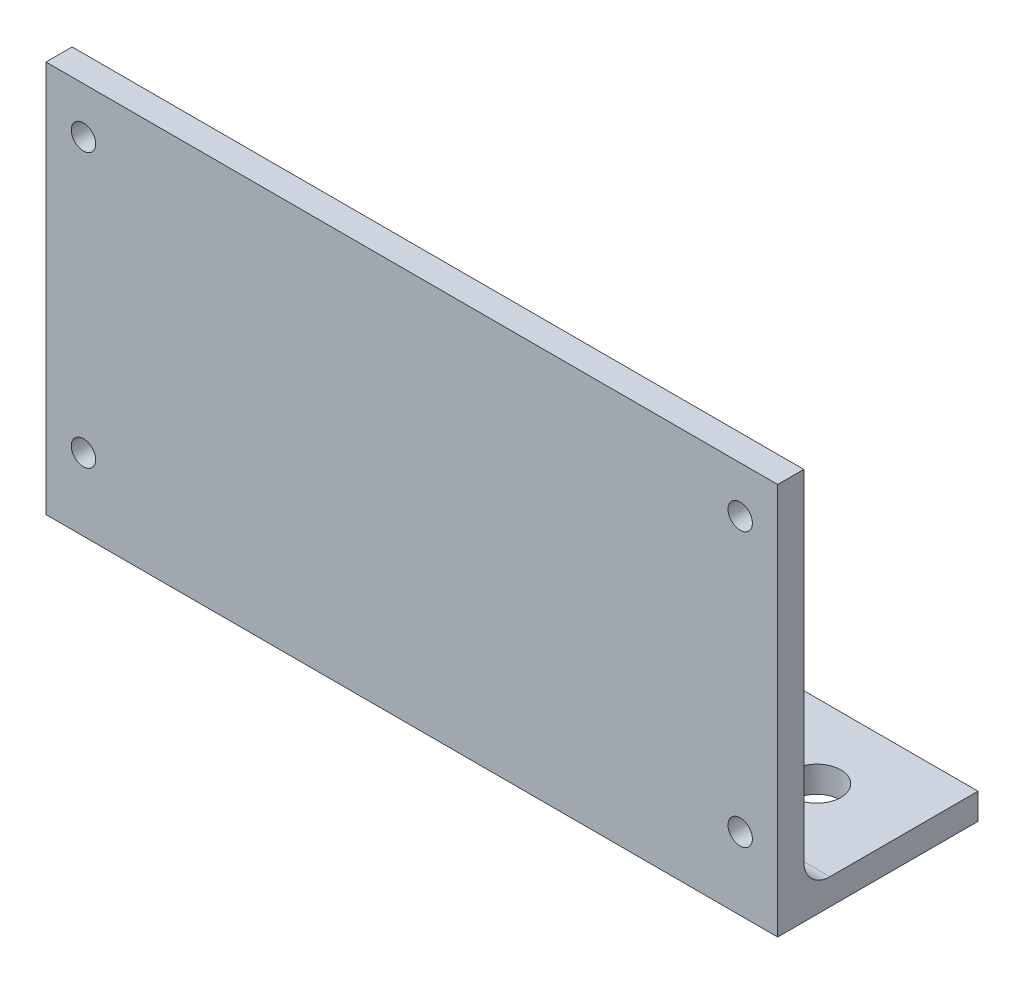
ISO-10303-21;
HEADER;
FILE_DESCRIPTION(('STEP AP214'),'2;1');
FILE_NAME('part.step','',(''),(''),'','','');
FILE_SCHEMA(('AUTOMOTIVE_DESIGN { 1 0 10303 214 1 1 1 1 }'));
ENDSEC;
DATA;
#1=APPLICATION_CONTEXT('core data for automotive mechanical design processes');
#2=APPLICATION_PROTOCOL_DEFINITION('international standard','automotive_design',2000,#1);
#3=PRODUCT_CONTEXT('',#1,'mechanical');
#4=PRODUCT('Part','Part','',(#3));
#5=PRODUCT_RELATED_PRODUCT_CATEGORY('part','',(#4));
#6=PRODUCT_DEFINITION_FORMATION('','',#4);
#7=PRODUCT_DEFINITION_CONTEXT('part definition',#1,'design');
#8=PRODUCT_DEFINITION('design','',#6,#7);
#9=PRODUCT_DEFINITION_SHAPE('','',#8);
#10=(LENGTH_UNIT() NAMED_UNIT(*) SI_UNIT(.MILLI.,.METRE.));
#11=(NAMED_UNIT(*) PLANE_ANGLE_UNIT() SI_UNIT($,.RADIAN.));
#12=(NAMED_UNIT(*) SI_UNIT($,.STERADIAN.) SOLID_ANGLE_UNIT());
#13=UNCERTAINTY_MEASURE_WITH_UNIT(LENGTH_MEASURE(1.E-05),#10,'distance_accuracy_value','');
#14=(GEOMETRIC_REPRESENTATION_CONTEXT(3) GLOBAL_UNCERTAINTY_ASSIGNED_CONTEXT((#13)) GLOBAL_UNIT_ASSIGNED_CONTEXT((#10,
#11,#12)) REPRESENTATION_CONTEXT('',''));
#15=CARTESIAN_POINT('',(0.,0.,0.));
#16=DIRECTION('',(0.,0.,1.));
#17=DIRECTION('',(1.,0.,0.));
#18=AXIS2_PLACEMENT_3D('',#15,#16,#17);
#19=CARTESIAN_POINT('',(0.,0.,3.));
#20=DIRECTION('',(0.,0.,-1.));
#21=DIRECTION('',(-1.,0.,0.));
#22=AXIS2_PLACEMENT_3D('',#19,#20,#21);
#23=PLANE('',#22);
#24=DIRECTION('',(0.,1.,0.));
#25=VECTOR('',#24,1.);
#26=CARTESIAN_POINT('',(42.,-21.,3.));
#27=LINE('',#26,#25);
#28=CARTESIAN_POINT('',(42.,-24.,3.));
#29=VERTEX_POINT('',#28);
#30=CARTESIAN_POINT('',(42.,21.,3.));
#31=VERTEX_POINT('',#30);
#32=EDGE_CURVE('E103',#29,#31,#27,.T.);
#33=ORIENTED_EDGE('',*,*,#32,.T.);
#34=DIRECTION('',(-1.,0.,0.));
#35=VECTOR('',#34,1.);
#36=CARTESIAN_POINT('',(-42.,21.,3.));
#37=LINE('',#36,#35);
#38=CARTESIAN_POINT('',(-42.,21.,3.));
#39=VERTEX_POINT('',#38);
#40=EDGE_CURVE('E166',#31,#39,#37,.T.);
#41=ORIENTED_EDGE('',*,*,#40,.T.);
#42=DIRECTION('',(0.,-1.,0.));
#43=VECTOR('',#42,1.);
#44=CARTESIAN_POINT('',(-42.,-21.,3.));
#45=LINE('',#44,#43);
#46=CARTESIAN_POINT('',(-42.,-24.,3.));
#47=VERTEX_POINT('',#46);
#48=EDGE_CURVE('E169',#39,#47,#45,.T.);
#49=ORIENTED_EDGE('',*,*,#48,.T.);
#50=DIRECTION('',(1.,0.,0.));
#51=VECTOR('',#50,1.);
#52=CARTESIAN_POINT('',(42.,-24.,3.));
#53=LINE('',#52,#51);
#54=EDGE_CURVE('E135',#47,#29,#53,.T.);
#55=ORIENTED_EDGE('',*,*,#54,.T.);
#56=EDGE_LOOP('',(#33,#41,#49,#55));
#57=FACE_BOUND('',#56,.T.);
#58=CARTESIAN_POINT('',(-37.7,15.7,3.));
#59=DIRECTION('',(0.,0.,1.));
#60=DIRECTION('',(1.,0.,0.));
#61=AXIS2_PLACEMENT_3D('',#58,#59,#60);
#62=CIRCLE('',#61,1.4);
#63=CARTESIAN_POINT('',(-36.3,15.7,3.));
#64=VERTEX_POINT('',#63);
#65=EDGE_CURVE('E159',#64,#64,#62,.T.);
#66=ORIENTED_EDGE('',*,*,#65,.F.);
#67=EDGE_LOOP('',(#66));
#68=FACE_BOUND('',#67,.T.);
#69=CARTESIAN_POINT('',(37.7,15.7,3.));
#70=DIRECTION('',(0.,0.,1.));
#71=DIRECTION('',(1.,0.,0.));
#72=AXIS2_PLACEMENT_3D('',#69,#70,#71);
#73=CIRCLE('',#72,1.4);
#74=CARTESIAN_POINT('',(39.1,15.7,3.));
#75=VERTEX_POINT('',#74);
#76=EDGE_CURVE('E153',#75,#75,#73,.T.);
#77=ORIENTED_EDGE('',*,*,#76,.F.);
#78=EDGE_LOOP('',(#77));
#79=FACE_BOUND('',#78,.T.);
#80=CARTESIAN_POINT('',(37.7,-15.7,3.));
#81=DIRECTION('',(0.,0.,1.));
#82=DIRECTION('',(1.,0.,0.));
#83=AXIS2_PLACEMENT_3D('',#80,#81,#82);
#84=CIRCLE('',#83,1.4);
#85=CARTESIAN_POINT('',(39.1,-15.7,3.));
#86=VERTEX_POINT('',#85);
#87=EDGE_CURVE('E147',#86,#86,#84,.T.);
#88=ORIENTED_EDGE('',*,*,#87,.F.);
#89=EDGE_LOOP('',(#88));
#90=FACE_BOUND('',#89,.T.);
#91=CARTESIAN_POINT('',(-37.7,-15.7,3.));
#92=DIRECTION('',(0.,0.,1.));
#93=DIRECTION('',(1.,0.,0.));
#94=AXIS2_PLACEMENT_3D('',#91,#92,#93);
#95=CIRCLE('',#94,1.4);
#96=CARTESIAN_POINT('',(-36.3,-15.7,3.));
#97=VERTEX_POINT('',#96);
#98=EDGE_CURVE('E141',#97,#97,#95,.T.);
#99=ORIENTED_EDGE('',*,*,#98,.F.);
#100=EDGE_LOOP('',(#99));
#101=FACE_BOUND('',#100,.T.);
#102=ADVANCED_FACE('F39',(#57,#68,#79,#90,#101),#23,.F.);
#103=CARTESIAN_POINT('',(0.,0.,0.));
#104=DIRECTION('',(0.,0.,-1.));
#105=DIRECTION('',(-1.,0.,0.));
#106=AXIS2_PLACEMENT_3D('',#103,#104,#105);
#107=PLANE('',#106);
#108=CARTESIAN_POINT('',(37.7,-15.7,0.));
#109=DIRECTION('',(0.,0.,1.));
#110=DIRECTION('',(1.,0.,0.));
#111=AXIS2_PLACEMENT_3D('',#108,#109,#110);
#112=CIRCLE('',#111,1.4);
#113=CARTESIAN_POINT('',(39.1,-15.7,0.));
#114=VERTEX_POINT('',#113);
#115=EDGE_CURVE('E144',#114,#114,#112,.T.);
#116=ORIENTED_EDGE('',*,*,#115,.T.);
#117=EDGE_LOOP('',(#116));
#118=FACE_BOUND('',#117,.T.);
#119=CARTESIAN_POINT('',(-37.7,15.7,0.));
#120=DIRECTION('',(0.,0.,1.));
#121=DIRECTION('',(1.,0.,0.));
#122=AXIS2_PLACEMENT_3D('',#119,#120,#121);
#123=CIRCLE('',#122,1.4);
#124=CARTESIAN_POINT('',(-36.3,15.7,0.));
#125=VERTEX_POINT('',#124);
#126=EDGE_CURVE('E156',#125,#125,#123,.T.);
#127=ORIENTED_EDGE('',*,*,#126,.T.);
#128=EDGE_LOOP('',(#127));
#129=FACE_BOUND('',#128,.T.);
#130=DIRECTION('',(0.,1.,0.));
#131=VECTOR('',#130,1.);
#132=CARTESIAN_POINT('',(42.,-21.,0.));
#133=LINE('',#132,#131);
#134=CARTESIAN_POINT('',(42.,-18.,0.));
#135=VERTEX_POINT('',#134);
#136=CARTESIAN_POINT('',(42.,21.,0.));
#137=VERTEX_POINT('',#136);
#138=EDGE_CURVE('E162',#135,#137,#133,.T.);
#139=ORIENTED_EDGE('',*,*,#138,.F.);
#140=DIRECTION('',(1.,0.,0.));
#141=VECTOR('',#140,1.);
#142=CARTESIAN_POINT('',(-42.,-18.,0.));
#143=LINE('',#142,#141);
#144=CARTESIAN_POINT('',(-42.,-18.,0.));
#145=VERTEX_POINT('',#144);
#146=EDGE_CURVE('E54',#135,#145,#143,.F.);
#147=ORIENTED_EDGE('',*,*,#146,.T.);
#148=DIRECTION('',(0.,-1.,0.));
#149=VECTOR('',#148,1.);
#150=CARTESIAN_POINT('',(-42.,-21.,0.));
#151=LINE('',#150,#149);
#152=CARTESIAN_POINT('',(-42.,21.,0.));
#153=VERTEX_POINT('',#152);
#154=EDGE_CURVE('E167',#153,#145,#151,.T.);
#155=ORIENTED_EDGE('',*,*,#154,.F.);
#156=DIRECTION('',(-1.,0.,0.));
#157=VECTOR('',#156,1.);
#158=CARTESIAN_POINT('',(-42.,21.,0.));
#159=LINE('',#158,#157);
#160=EDGE_CURVE('E173',#137,#153,#159,.T.);
#161=ORIENTED_EDGE('',*,*,#160,.F.);
#162=EDGE_LOOP('',(#139,#147,#155,#161));
#163=FACE_BOUND('',#162,.T.);
#164=CARTESIAN_POINT('',(37.7,15.7,0.));
#165=DIRECTION('',(0.,0.,1.));
#166=DIRECTION('',(1.,0.,0.));
#167=AXIS2_PLACEMENT_3D('',#164,#165,#166);
#168=CIRCLE('',#167,1.4);
#169=CARTESIAN_POINT('',(39.1,15.7,0.));
#170=VERTEX_POINT('',#169);
#171=EDGE_CURVE('E150',#170,#170,#168,.T.);
#172=ORIENTED_EDGE('',*,*,#171,.T.);
#173=EDGE_LOOP('',(#172));
#174=FACE_BOUND('',#173,.T.);
#175=CARTESIAN_POINT('',(-37.7,-15.7,0.));
#176=DIRECTION('',(0.,0.,1.));
#177=DIRECTION('',(1.,0.,0.));
#178=AXIS2_PLACEMENT_3D('',#175,#176,#177);
#179=CIRCLE('',#178,1.4);
#180=CARTESIAN_POINT('',(-36.3,-15.7,0.));
#181=VERTEX_POINT('',#180);
#182=EDGE_CURVE('E140',#181,#181,#179,.T.);
#183=ORIENTED_EDGE('',*,*,#182,.T.);
#184=EDGE_LOOP('',(#183));
#185=FACE_BOUND('',#184,.T.);
#186=ADVANCED_FACE('F195',(#118,#129,#163,#174,#185),#107,.T.);
#187=CARTESIAN_POINT('',(42.,-21.,3.));
#188=DIRECTION('',(-1.,0.,0.));
#189=DIRECTION('',(0.,0.,1.));
#190=AXIS2_PLACEMENT_3D('',#187,#188,#189);
#191=PLANE('',#190);
#192=DIRECTION('',(0.,0.,-1.));
#193=VECTOR('',#192,1.);
#194=CARTESIAN_POINT('',(42.,-21.,87.0535543567314));
#195=LINE('',#194,#193);
#196=CARTESIAN_POINT('',(42.,-21.,-3.));
#197=VERTEX_POINT('',#196);
#198=CARTESIAN_POINT('',(42.,-21.,-20.));
#199=VERTEX_POINT('',#198);
#200=EDGE_CURVE('E133',#197,#199,#195,.T.);
#201=ORIENTED_EDGE('',*,*,#200,.F.);
#202=CARTESIAN_POINT('',(42.,-18.,-3.));
#203=DIRECTION('',(-1.,0.,0.));
#204=DIRECTION('',(0.,0.,1.));
#205=AXIS2_PLACEMENT_3D('',#202,#203,#204);
#206=CIRCLE('',#205,3.);
#207=EDGE_CURVE('E47',#197,#135,#206,.T.);
#208=ORIENTED_EDGE('',*,*,#207,.T.);
#209=ORIENTED_EDGE('',*,*,#138,.T.);
#210=DIRECTION('',(0.,0.,-1.));
#211=VECTOR('',#210,1.);
#212=CARTESIAN_POINT('',(42.,21.,3.));
#213=LINE('',#212,#211);
#214=EDGE_CURVE('E178',#31,#137,#213,.T.);
#215=ORIENTED_EDGE('',*,*,#214,.F.);
#216=ORIENTED_EDGE('',*,*,#32,.F.);
#217=DIRECTION('',(0.,0.,-1.));
#218=VECTOR('',#217,1.);
#219=CARTESIAN_POINT('',(42.,-24.,87.0535543567314));
#220=LINE('',#219,#218);
#221=CARTESIAN_POINT('',(42.,-24.,-20.));
#222=VERTEX_POINT('',#221);
#223=EDGE_CURVE('E96',#29,#222,#220,.T.);
#224=ORIENTED_EDGE('',*,*,#223,.T.);
#225=DIRECTION('',(0.,-1.,0.));
#226=VECTOR('',#225,1.);
#227=CARTESIAN_POINT('',(42.,-21.,-20.));
#228=LINE('',#227,#226);
#229=EDGE_CURVE('E100',#199,#222,#228,.T.);
#230=ORIENTED_EDGE('',*,*,#229,.F.);
#231=EDGE_LOOP('',(#201,#208,#209,#215,#216,#224,#230));
#232=FACE_BOUND('',#231,.T.);
#233=ADVANCED_FACE('F98',(#232),#191,.F.);
#234=CARTESIAN_POINT('',(-42.,21.,3.));
#235=DIRECTION('',(0.,-1.,0.));
#236=DIRECTION('',(0.,0.,-1.));
#237=AXIS2_PLACEMENT_3D('',#234,#235,#236);
#238=PLANE('',#237);
#239=ORIENTED_EDGE('',*,*,#160,.T.);
#240=DIRECTION('',(0.,0.,-1.));
#241=VECTOR('',#240,1.);
#242=CARTESIAN_POINT('',(-42.,21.,3.));
#243=LINE('',#242,#241);
#244=EDGE_CURVE('E171',#39,#153,#243,.T.);
#245=ORIENTED_EDGE('',*,*,#244,.F.);
#246=ORIENTED_EDGE('',*,*,#40,.F.);
#247=ORIENTED_EDGE('',*,*,#214,.T.);
#248=EDGE_LOOP('',(#239,#245,#246,#247));
#249=FACE_BOUND('',#248,.T.);
#250=ADVANCED_FACE('F198',(#249),#238,.F.);
#251=CARTESIAN_POINT('',(-42.,-21.,3.));
#252=DIRECTION('',(1.,0.,0.));
#253=DIRECTION('',(0.,0.,-1.));
#254=AXIS2_PLACEMENT_3D('',#251,#252,#253);
#255=PLANE('',#254);
#256=ORIENTED_EDGE('',*,*,#154,.T.);
#257=CARTESIAN_POINT('',(-42.,-18.,-3.));
#258=DIRECTION('',(1.,0.,0.));
#259=DIRECTION('',(0.,0.,-1.));
#260=AXIS2_PLACEMENT_3D('',#257,#258,#259);
#261=CIRCLE('',#260,3.);
#262=CARTESIAN_POINT('',(-42.,-21.,-3.));
#263=VERTEX_POINT('',#262);
#264=EDGE_CURVE('E11',#145,#263,#261,.T.);
#265=ORIENTED_EDGE('',*,*,#264,.T.);
#266=DIRECTION('',(0.,0.,-1.));
#267=VECTOR('',#266,1.);
#268=CARTESIAN_POINT('',(-42.,-21.,87.0535543567314));
#269=LINE('',#268,#267);
#270=CARTESIAN_POINT('',(-42.,-21.,-20.));
#271=VERTEX_POINT('',#270);
#272=EDGE_CURVE('E136',#263,#271,#269,.T.);
#273=ORIENTED_EDGE('',*,*,#272,.T.);
#274=DIRECTION('',(0.,1.,0.));
#275=VECTOR('',#274,1.);
#276=CARTESIAN_POINT('',(-42.,-21.,-20.));
#277=LINE('',#276,#275);
#278=CARTESIAN_POINT('',(-42.,-24.,-20.));
#279=VERTEX_POINT('',#278);
#280=EDGE_CURVE('E117',#279,#271,#277,.T.);
#281=ORIENTED_EDGE('',*,*,#280,.F.);
#282=DIRECTION('',(0.,0.,-1.));
#283=VECTOR('',#282,1.);
#284=CARTESIAN_POINT('',(-42.,-24.,87.0535543567314));
#285=LINE('',#284,#283);
#286=EDGE_CURVE('E107',#47,#279,#285,.T.);
#287=ORIENTED_EDGE('',*,*,#286,.F.);
#288=ORIENTED_EDGE('',*,*,#48,.F.);
#289=ORIENTED_EDGE('',*,*,#244,.T.);
#290=EDGE_LOOP('',(#256,#265,#273,#281,#287,#288,#289));
#291=FACE_BOUND('',#290,.T.);
#292=ADVANCED_FACE('F191',(#291),#255,.F.);
#293=CARTESIAN_POINT('',(-37.7,15.7,3.));
#294=DIRECTION('',(0.,0.,-1.));
#295=DIRECTION('',(-1.,0.,0.));
#296=AXIS2_PLACEMENT_3D('',#293,#294,#295);
#297=CYLINDRICAL_SURFACE('',#296,1.4);
#298=ORIENTED_EDGE('',*,*,#65,.T.);
#299=EDGE_LOOP('',(#298));
#300=FACE_BOUND('',#299,.T.);
#301=ORIENTED_EDGE('',*,*,#126,.F.);
#302=EDGE_LOOP('',(#301));
#303=FACE_BOUND('',#302,.T.);
#304=ADVANCED_FACE('F229',(#300,#303),#297,.F.);
#305=CARTESIAN_POINT('',(37.7,15.7,3.));
#306=DIRECTION('',(0.,0.,-1.));
#307=DIRECTION('',(-1.,0.,0.));
#308=AXIS2_PLACEMENT_3D('',#305,#306,#307);
#309=CYLINDRICAL_SURFACE('',#308,1.4);
#310=ORIENTED_EDGE('',*,*,#76,.T.);
#311=EDGE_LOOP('',(#310));
#312=FACE_BOUND('',#311,.T.);
#313=ORIENTED_EDGE('',*,*,#171,.F.);
#314=EDGE_LOOP('',(#313));
#315=FACE_BOUND('',#314,.T.);
#316=ADVANCED_FACE('F246',(#312,#315),#309,.F.);
#317=CARTESIAN_POINT('',(37.7,-15.7,3.));
#318=DIRECTION('',(0.,0.,-1.));
#319=DIRECTION('',(-1.,0.,0.));
#320=AXIS2_PLACEMENT_3D('',#317,#318,#319);
#321=CYLINDRICAL_SURFACE('',#320,1.4);
#322=ORIENTED_EDGE('',*,*,#87,.T.);
#323=EDGE_LOOP('',(#322));
#324=FACE_BOUND('',#323,.T.);
#325=ORIENTED_EDGE('',*,*,#115,.F.);
#326=EDGE_LOOP('',(#325));
#327=FACE_BOUND('',#326,.T.);
#328=ADVANCED_FACE('F214',(#324,#327),#321,.F.);
#329=CARTESIAN_POINT('',(-37.7,-15.7,3.));
#330=DIRECTION('',(0.,0.,-1.));
#331=DIRECTION('',(-1.,0.,0.));
#332=AXIS2_PLACEMENT_3D('',#329,#330,#331);
#333=CYLINDRICAL_SURFACE('',#332,1.4);
#334=ORIENTED_EDGE('',*,*,#98,.T.);
#335=EDGE_LOOP('',(#334));
#336=FACE_BOUND('',#335,.T.);
#337=ORIENTED_EDGE('',*,*,#182,.F.);
#338=EDGE_LOOP('',(#337));
#339=FACE_BOUND('',#338,.T.);
#340=ADVANCED_FACE('F211',(#336,#339),#333,.F.);
#341=CARTESIAN_POINT('',(42.,-21.,87.0535543567314));
#342=DIRECTION('',(0.,1.,0.));
#343=DIRECTION('',(0.,0.,1.));
#344=AXIS2_PLACEMENT_3D('',#341,#342,#343);
#345=PLANE('',#344);
#346=CARTESIAN_POINT('',(-32.,-21.,-11.5));
#347=DIRECTION('',(0.,1.,0.));
#348=DIRECTION('',(0.,0.,1.));
#349=AXIS2_PLACEMENT_3D('',#346,#347,#348);
#350=CIRCLE('',#349,2.75);
#351=CARTESIAN_POINT('',(-32.,-21.,-8.74999999999999));
#352=VERTEX_POINT('',#351);
#353=EDGE_CURVE('E125',#352,#352,#350,.T.);
#354=ORIENTED_EDGE('',*,*,#353,.F.);
#355=EDGE_LOOP('',(#354));
#356=FACE_BOUND('',#355,.T.);
#357=CARTESIAN_POINT('',(32.,-21.,-11.5));
#358=DIRECTION('',(0.,1.,0.));
#359=DIRECTION('',(0.,0.,1.));
#360=AXIS2_PLACEMENT_3D('',#357,#358,#359);
#361=CIRCLE('',#360,2.75);
#362=CARTESIAN_POINT('',(32.,-21.,-8.74999999999999));
#363=VERTEX_POINT('',#362);
#364=EDGE_CURVE('E128',#363,#363,#361,.T.);
#365=ORIENTED_EDGE('',*,*,#364,.F.);
#366=EDGE_LOOP('',(#365));
#367=FACE_BOUND('',#366,.T.);
#368=ORIENTED_EDGE('',*,*,#272,.F.);
#369=DIRECTION('',(1.,0.,0.));
#370=VECTOR('',#369,1.);
#371=CARTESIAN_POINT('',(42.,-21.,-3.));
#372=LINE('',#371,#370);
#373=EDGE_CURVE('E181',#263,#197,#372,.T.);
#374=ORIENTED_EDGE('',*,*,#373,.T.);
#375=ORIENTED_EDGE('',*,*,#200,.T.);
#376=DIRECTION('',(1.,0.,0.));
#377=VECTOR('',#376,1.);
#378=CARTESIAN_POINT('',(42.,-21.,-20.));
#379=LINE('',#378,#377);
#380=EDGE_CURVE('E108',#271,#199,#379,.T.);
#381=ORIENTED_EDGE('',*,*,#380,.F.);
#382=EDGE_LOOP('',(#368,#374,#375,#381));
#383=FACE_BOUND('',#382,.T.);
#384=ADVANCED_FACE('F187',(#356,#367,#383),#345,.T.);
#385=CARTESIAN_POINT('',(42.,-24.,87.0535543567314));
#386=DIRECTION('',(0.,-1.,0.));
#387=DIRECTION('',(0.,0.,-1.));
#388=AXIS2_PLACEMENT_3D('',#385,#386,#387);
#389=PLANE('',#388);
#390=CARTESIAN_POINT('',(-32.,-24.,-11.5));
#391=DIRECTION('',(0.,-1.,0.));
#392=DIRECTION('',(0.,0.,-1.));
#393=AXIS2_PLACEMENT_3D('',#390,#391,#392);
#394=CIRCLE('',#393,2.75);
#395=CARTESIAN_POINT('',(-32.,-24.,-14.25));
#396=VERTEX_POINT('',#395);
#397=EDGE_CURVE('E122',#396,#396,#394,.F.);
#398=ORIENTED_EDGE('',*,*,#397,.T.);
#399=EDGE_LOOP('',(#398));
#400=FACE_BOUND('',#399,.T.);
#401=CARTESIAN_POINT('',(32.,-24.,-11.5));
#402=DIRECTION('',(0.,-1.,0.));
#403=DIRECTION('',(0.,0.,-1.));
#404=AXIS2_PLACEMENT_3D('',#401,#402,#403);
#405=CIRCLE('',#404,2.75);
#406=CARTESIAN_POINT('',(32.,-24.,-14.25));
#407=VERTEX_POINT('',#406);
#408=EDGE_CURVE('E391',#407,#407,#405,.F.);
#409=ORIENTED_EDGE('',*,*,#408,.T.);
#410=EDGE_LOOP('',(#409));
#411=FACE_BOUND('',#410,.T.);
#412=ORIENTED_EDGE('',*,*,#54,.F.);
#413=ORIENTED_EDGE('',*,*,#286,.T.);
#414=DIRECTION('',(-1.,0.,0.));
#415=VECTOR('',#414,1.);
#416=CARTESIAN_POINT('',(42.,-24.,-20.));
#417=LINE('',#416,#415);
#418=EDGE_CURVE('E111',#222,#279,#417,.T.);
#419=ORIENTED_EDGE('',*,*,#418,.F.);
#420=ORIENTED_EDGE('',*,*,#223,.F.);
#421=EDGE_LOOP('',(#412,#413,#419,#420));
#422=FACE_BOUND('',#421,.T.);
#423=ADVANCED_FACE('F112',(#400,#411,#422),#389,.T.);
#424=CARTESIAN_POINT('',(0.,0.,-20.));
#425=DIRECTION('',(0.,0.,-1.));
#426=DIRECTION('',(-1.,0.,0.));
#427=AXIS2_PLACEMENT_3D('',#424,#425,#426);
#428=PLANE('',#427);
#429=ORIENTED_EDGE('',*,*,#229,.T.);
#430=ORIENTED_EDGE('',*,*,#418,.T.);
#431=ORIENTED_EDGE('',*,*,#280,.T.);
#432=ORIENTED_EDGE('',*,*,#380,.T.);
#433=EDGE_LOOP('',(#429,#430,#431,#432));
#434=FACE_BOUND('',#433,.T.);
#435=ADVANCED_FACE('F120',(#434),#428,.T.);
#436=CARTESIAN_POINT('',(42.,-18.,-3.));
#437=DIRECTION('',(-1.,0.,0.));
#438=DIRECTION('',(0.,0.,1.));
#439=AXIS2_PLACEMENT_3D('',#436,#437,#438);
#440=CYLINDRICAL_SURFACE('',#439,3.);
#441=ORIENTED_EDGE('',*,*,#264,.F.);
#442=ORIENTED_EDGE('',*,*,#146,.F.);
#443=ORIENTED_EDGE('',*,*,#207,.F.);
#444=ORIENTED_EDGE('',*,*,#373,.F.);
#445=EDGE_LOOP('',(#441,#442,#443,#444));
#446=FACE_BOUND('',#445,.T.);
#447=ADVANCED_FACE('F41',(#446),#440,.F.);
#448=CARTESIAN_POINT('',(32.,-31.778174593052,-11.5));
#449=DIRECTION('',(0.,1.,0.));
#450=DIRECTION('',(0.,0.,1.));
#451=AXIS2_PLACEMENT_3D('',#448,#449,#450);
#452=CYLINDRICAL_SURFACE('',#451,2.75);
#453=ORIENTED_EDGE('',*,*,#364,.T.);
#454=EDGE_LOOP('',(#453));
#455=FACE_BOUND('',#454,.T.);
#456=ORIENTED_EDGE('',*,*,#408,.F.);
#457=EDGE_LOOP('',(#456));
#458=FACE_BOUND('',#457,.T.);
#459=ADVANCED_FACE('F292',(#455,#458),#452,.F.);
#460=CARTESIAN_POINT('',(-32.,-31.778174593052,-11.5));
#461=DIRECTION('',(0.,1.,0.));
#462=DIRECTION('',(0.,0.,1.));
#463=AXIS2_PLACEMENT_3D('',#460,#461,#462);
#464=CYLINDRICAL_SURFACE('',#463,2.75);
#465=ORIENTED_EDGE('',*,*,#353,.T.);
#466=EDGE_LOOP('',(#465));
#467=FACE_BOUND('',#466,.T.);
#468=ORIENTED_EDGE('',*,*,#397,.F.);
#469=EDGE_LOOP('',(#468));
#470=FACE_BOUND('',#469,.T.);
#471=ADVANCED_FACE('F297',(#467,#470),#464,.F.);
#472=CLOSED_SHELL('',(#102,#186,#233,#250,#292,#304,#316,#328,#340,#384,#423,#435,#447,#459,#471));
#473=MANIFOLD_SOLID_BREP('B2',#472);
#474=ADVANCED_BREP_SHAPE_REPRESENTATION('',(#18,#473),#14);
#475=SHAPE_DEFINITION_REPRESENTATION(#9,#474);
ENDSEC;
END-ISO-10303-21;
